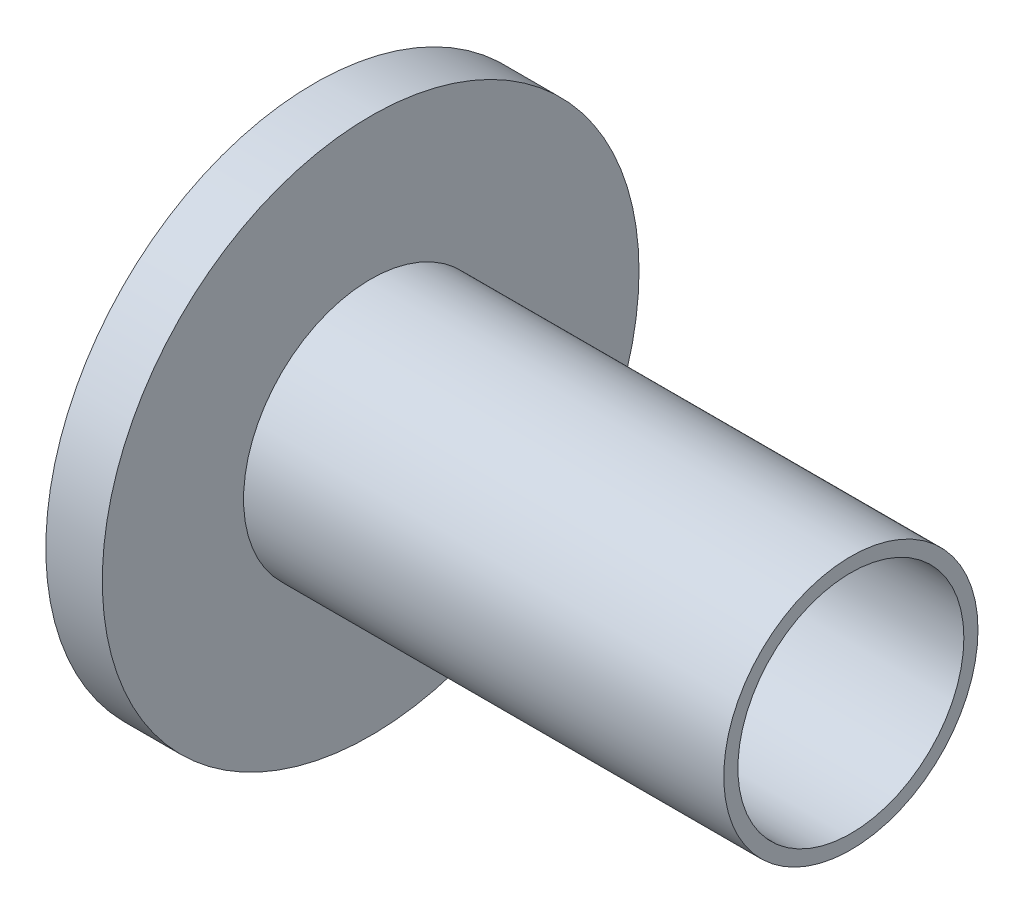
ISO-10303-21;
HEADER;
FILE_DESCRIPTION(('STEP AP214'),'2;1');
FILE_NAME('part.step','',(''),(''),'','','');
FILE_SCHEMA(('AUTOMOTIVE_DESIGN { 1 0 10303 214 1 1 1 1 }'));
ENDSEC;
DATA;
#1=APPLICATION_CONTEXT('core data for automotive mechanical design processes');
#2=APPLICATION_PROTOCOL_DEFINITION('international standard','automotive_design',2000,#1);
#3=PRODUCT_CONTEXT('',#1,'mechanical');
#4=PRODUCT('Part','Part','',(#3));
#5=PRODUCT_RELATED_PRODUCT_CATEGORY('part','',(#4));
#6=PRODUCT_DEFINITION_FORMATION('','',#4);
#7=PRODUCT_DEFINITION_CONTEXT('part definition',#1,'design');
#8=PRODUCT_DEFINITION('design','',#6,#7);
#9=PRODUCT_DEFINITION_SHAPE('','',#8);
#10=(LENGTH_UNIT() NAMED_UNIT(*) SI_UNIT(.MILLI.,.METRE.));
#11=(NAMED_UNIT(*) PLANE_ANGLE_UNIT() SI_UNIT($,.RADIAN.));
#12=(NAMED_UNIT(*) SI_UNIT($,.STERADIAN.) SOLID_ANGLE_UNIT());
#13=UNCERTAINTY_MEASURE_WITH_UNIT(LENGTH_MEASURE(1.E-05),#10,'distance_accuracy_value','');
#14=(GEOMETRIC_REPRESENTATION_CONTEXT(3) GLOBAL_UNCERTAINTY_ASSIGNED_CONTEXT((#13)) GLOBAL_UNIT_ASSIGNED_CONTEXT((#10,
#11,#12)) REPRESENTATION_CONTEXT('',''));
#15=CARTESIAN_POINT('',(0.,0.,0.));
#16=DIRECTION('',(0.,0.,1.));
#17=DIRECTION('',(1.,0.,0.));
#18=AXIS2_PLACEMENT_3D('',#15,#16,#17);
#19=CARTESIAN_POINT('',(6.,8.,0.));
#20=DIRECTION('',(1.,0.,0.));
#21=DIRECTION('',(0.,0.,-1.));
#22=AXIS2_PLACEMENT_3D('',#19,#20,#21);
#23=PLANE('',#22);
#24=CARTESIAN_POINT('',(6.,8.,0.));
#25=DIRECTION('',(1.,0.,0.));
#26=DIRECTION('',(0.,0.,-1.));
#27=AXIS2_PLACEMENT_3D('',#24,#25,#26);
#28=CIRCLE('',#27,4.);
#29=CARTESIAN_POINT('',(6.,8.,-4.));
#30=VERTEX_POINT('',#29);
#31=EDGE_CURVE('E57',#30,#30,#28,.T.);
#32=ORIENTED_EDGE('',*,*,#31,.F.);
#33=EDGE_LOOP('',(#32));
#34=FACE_BOUND('',#33,.T.);
#35=CARTESIAN_POINT('',(6.,8.,0.));
#36=DIRECTION('',(1.,0.,0.));
#37=DIRECTION('',(0.,0.,-1.));
#38=AXIS2_PLACEMENT_3D('',#35,#36,#37);
#39=CIRCLE('',#38,4.5);
#40=CARTESIAN_POINT('',(6.,8.,-4.5));
#41=VERTEX_POINT('',#40);
#42=EDGE_CURVE('E10',#41,#41,#39,.T.);
#43=ORIENTED_EDGE('',*,*,#42,.T.);
#44=EDGE_LOOP('',(#43));
#45=FACE_BOUND('',#44,.T.);
#46=ADVANCED_FACE('F37',(#34,#45),#23,.T.);
#47=CARTESIAN_POINT('',(6.,8.,0.));
#48=DIRECTION('',(1.,0.,0.));
#49=DIRECTION('',(0.,0.,-1.));
#50=AXIS2_PLACEMENT_3D('',#47,#48,#49);
#51=CYLINDRICAL_SURFACE('',#50,4.5);
#52=CARTESIAN_POINT('',(-11.,8.,0.));
#53=DIRECTION('',(1.,0.,0.));
#54=DIRECTION('',(0.,0.,-1.));
#55=AXIS2_PLACEMENT_3D('',#52,#53,#54);
#56=CIRCLE('',#55,4.5);
#57=CARTESIAN_POINT('',(-11.,8.,-4.5));
#58=VERTEX_POINT('',#57);
#59=EDGE_CURVE('E43',#58,#58,#56,.T.);
#60=ORIENTED_EDGE('',*,*,#59,.T.);
#61=EDGE_LOOP('',(#60));
#62=FACE_BOUND('',#61,.T.);
#63=ORIENTED_EDGE('',*,*,#42,.F.);
#64=EDGE_LOOP('',(#63));
#65=FACE_BOUND('',#64,.T.);
#66=ADVANCED_FACE('F73',(#62,#65),#51,.T.);
#67=CARTESIAN_POINT('',(-11.,17.5,0.));
#68=DIRECTION('',(1.,0.,0.));
#69=DIRECTION('',(0.,0.,-1.));
#70=AXIS2_PLACEMENT_3D('',#67,#68,#69);
#71=PLANE('',#70);
#72=CARTESIAN_POINT('',(-11.,8.,0.));
#73=DIRECTION('',(1.,0.,0.));
#74=DIRECTION('',(0.,0.,-1.));
#75=AXIS2_PLACEMENT_3D('',#72,#73,#74);
#76=CIRCLE('',#75,9.5);
#77=CARTESIAN_POINT('',(-11.,8.,-9.5));
#78=VERTEX_POINT('',#77);
#79=EDGE_CURVE('E47',#78,#78,#76,.T.);
#80=ORIENTED_EDGE('',*,*,#79,.T.);
#81=EDGE_LOOP('',(#80));
#82=FACE_BOUND('',#81,.T.);
#83=ORIENTED_EDGE('',*,*,#59,.F.);
#84=EDGE_LOOP('',(#83));
#85=FACE_BOUND('',#84,.T.);
#86=ADVANCED_FACE('F79',(#82,#85),#71,.T.);
#87=CARTESIAN_POINT('',(6.,8.,0.));
#88=DIRECTION('',(1.,0.,0.));
#89=DIRECTION('',(0.,0.,-1.));
#90=AXIS2_PLACEMENT_3D('',#87,#88,#89);
#91=CYLINDRICAL_SURFACE('',#90,9.5);
#92=CARTESIAN_POINT('',(-13.,8.,0.));
#93=DIRECTION('',(1.,0.,0.));
#94=DIRECTION('',(0.,0.,-1.));
#95=AXIS2_PLACEMENT_3D('',#92,#93,#94);
#96=CIRCLE('',#95,9.5);
#97=CARTESIAN_POINT('',(-13.,8.,-9.5));
#98=VERTEX_POINT('',#97);
#99=EDGE_CURVE('E51',#98,#98,#96,.T.);
#100=ORIENTED_EDGE('',*,*,#99,.T.);
#101=EDGE_LOOP('',(#100));
#102=FACE_BOUND('',#101,.T.);
#103=ORIENTED_EDGE('',*,*,#79,.F.);
#104=EDGE_LOOP('',(#103));
#105=FACE_BOUND('',#104,.T.);
#106=ADVANCED_FACE('F83',(#102,#105),#91,.T.);
#107=CARTESIAN_POINT('',(-13.,8.,0.));
#108=DIRECTION('',(-1.,0.,0.));
#109=DIRECTION('',(0.,0.,1.));
#110=AXIS2_PLACEMENT_3D('',#107,#108,#109);
#111=PLANE('',#110);
#112=CARTESIAN_POINT('',(-13.,8.,0.));
#113=DIRECTION('',(1.,0.,0.));
#114=DIRECTION('',(0.,0.,-1.));
#115=AXIS2_PLACEMENT_3D('',#112,#113,#114);
#116=CIRCLE('',#115,4.);
#117=CARTESIAN_POINT('',(-13.,8.,-4.));
#118=VERTEX_POINT('',#117);
#119=EDGE_CURVE('E56',#118,#118,#116,.T.);
#120=ORIENTED_EDGE('',*,*,#119,.T.);
#121=EDGE_LOOP('',(#120));
#122=FACE_BOUND('',#121,.T.);
#123=ORIENTED_EDGE('',*,*,#99,.F.);
#124=EDGE_LOOP('',(#123));
#125=FACE_BOUND('',#124,.T.);
#126=ADVANCED_FACE('F63',(#122,#125),#111,.T.);
#127=CARTESIAN_POINT('',(-13.,8.,0.));
#128=DIRECTION('',(1.,0.,0.));
#129=DIRECTION('',(0.,0.,-1.));
#130=AXIS2_PLACEMENT_3D('',#127,#128,#129);
#131=CYLINDRICAL_SURFACE('',#130,4.);
#132=ORIENTED_EDGE('',*,*,#119,.F.);
#133=EDGE_LOOP('',(#132));
#134=FACE_BOUND('',#133,.T.);
#135=ORIENTED_EDGE('',*,*,#31,.T.);
#136=EDGE_LOOP('',(#135));
#137=FACE_BOUND('',#136,.T.);
#138=ADVANCED_FACE('F66',(#134,#137),#131,.F.);
#139=CLOSED_SHELL('',(#46,#66,#86,#106,#126,#138));
#140=MANIFOLD_SOLID_BREP('B2',#139);
#141=ADVANCED_BREP_SHAPE_REPRESENTATION('',(#18,#140),#14);
#142=SHAPE_DEFINITION_REPRESENTATION(#9,#141);
ENDSEC;
END-ISO-10303-21;
